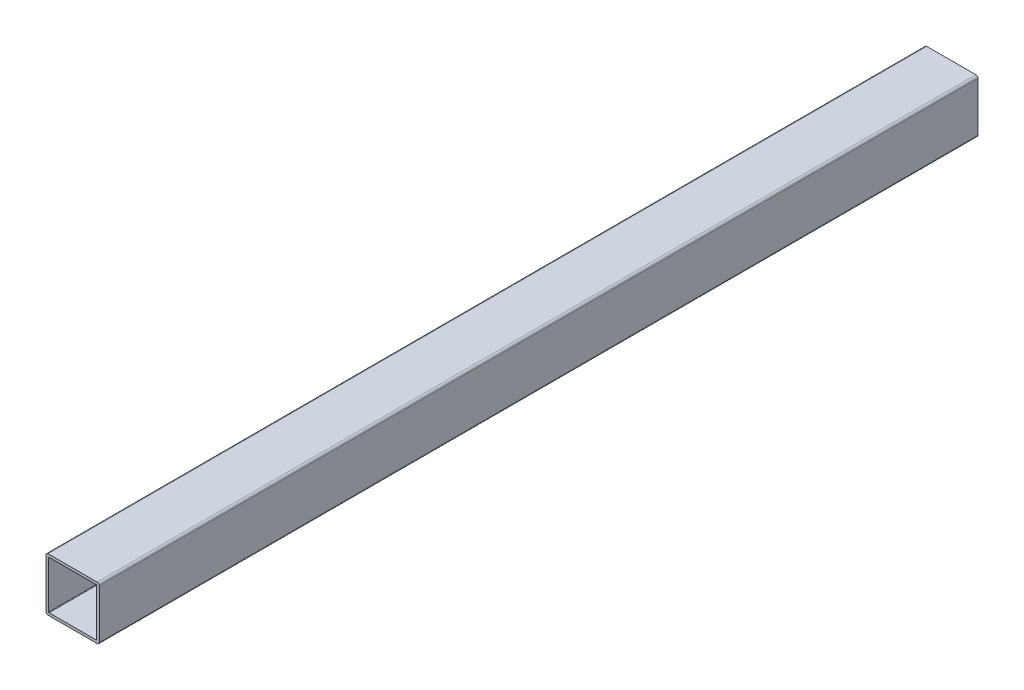
ISO-10303-21;
HEADER;
FILE_DESCRIPTION(('STEP AP214'),'2;1');
FILE_NAME('part.step','',(''),(''),'','','');
FILE_SCHEMA(('AUTOMOTIVE_DESIGN { 1 0 10303 214 1 1 1 1 }'));
ENDSEC;
DATA;
#1=APPLICATION_CONTEXT('core data for automotive mechanical design processes');
#2=APPLICATION_PROTOCOL_DEFINITION('international standard','automotive_design',2000,#1);
#3=PRODUCT_CONTEXT('',#1,'mechanical');
#4=PRODUCT('Part','Part','',(#3));
#5=PRODUCT_RELATED_PRODUCT_CATEGORY('part','',(#4));
#6=PRODUCT_DEFINITION_FORMATION('','',#4);
#7=PRODUCT_DEFINITION_CONTEXT('part definition',#1,'design');
#8=PRODUCT_DEFINITION('design','',#6,#7);
#9=PRODUCT_DEFINITION_SHAPE('','',#8);
#10=(LENGTH_UNIT() NAMED_UNIT(*) SI_UNIT(.MILLI.,.METRE.));
#11=(NAMED_UNIT(*) PLANE_ANGLE_UNIT() SI_UNIT($,.RADIAN.));
#12=(NAMED_UNIT(*) SI_UNIT($,.STERADIAN.) SOLID_ANGLE_UNIT());
#13=UNCERTAINTY_MEASURE_WITH_UNIT(LENGTH_MEASURE(1.E-05),#10,'distance_accuracy_value','');
#14=(GEOMETRIC_REPRESENTATION_CONTEXT(3) GLOBAL_UNCERTAINTY_ASSIGNED_CONTEXT((#13)) GLOBAL_UNIT_ASSIGNED_CONTEXT((#10,
#11,#12)) REPRESENTATION_CONTEXT('',''));
#15=CARTESIAN_POINT('',(0.,0.,0.));
#16=DIRECTION('',(0.,0.,1.));
#17=DIRECTION('',(1.,0.,0.));
#18=AXIS2_PLACEMENT_3D('',#15,#16,#17);
#19=CARTESIAN_POINT('',(1175.,100.,-825.));
#20=DIRECTION('',(-1.,0.,0.));
#21=DIRECTION('',(0.,0.,1.));
#22=AXIS2_PLACEMENT_3D('',#19,#20,#21);
#23=PLANE('',#22);
#24=DIRECTION('',(0.,0.,1.));
#25=VECTOR('',#24,1.);
#26=CARTESIAN_POINT('',(1175.,596.,-825.));
#27=LINE('',#26,#25);
#28=CARTESIAN_POINT('',(1175.,596.,825.));
#29=VERTEX_POINT('',#28);
#30=CARTESIAN_POINT('',(1175.,596.,-825.));
#31=VERTEX_POINT('',#30);
#32=EDGE_CURVE('E143',#29,#31,#27,.F.);
#33=ORIENTED_EDGE('',*,*,#32,.T.);
#34=DIRECTION('',(0.,1.,0.));
#35=VECTOR('',#34,1.);
#36=CARTESIAN_POINT('',(1175.,500.,-825.));
#37=LINE('',#36,#35);
#38=CARTESIAN_POINT('',(1175.,504.,-825.));
#39=VERTEX_POINT('',#38);
#40=EDGE_CURVE('E218',#39,#31,#37,.T.);
#41=ORIENTED_EDGE('',*,*,#40,.F.);
#42=DIRECTION('',(0.,0.,-1.));
#43=VECTOR('',#42,1.);
#44=CARTESIAN_POINT('',(1175.,504.,-825.));
#45=LINE('',#44,#43);
#46=CARTESIAN_POINT('',(1175.,504.,825.));
#47=VERTEX_POINT('',#46);
#48=EDGE_CURVE('E157',#39,#47,#45,.F.);
#49=ORIENTED_EDGE('',*,*,#48,.T.);
#50=DIRECTION('',(0.,1.,0.));
#51=VECTOR('',#50,1.);
#52=CARTESIAN_POINT('',(1175.,500.,825.));
#53=LINE('',#52,#51);
#54=EDGE_CURVE('E220',#47,#29,#53,.T.);
#55=ORIENTED_EDGE('',*,*,#54,.T.);
#56=EDGE_LOOP('',(#33,#41,#49,#55));
#57=FACE_BOUND('',#56,.T.);
#58=ADVANCED_FACE('F19',(#57),#23,.T.);
#59=CARTESIAN_POINT('',(-358.3,500.,825.));
#60=DIRECTION('',(0.,-1.,0.));
#61=DIRECTION('',(0.,0.,-1.));
#62=AXIS2_PLACEMENT_3D('',#59,#60,#61);
#63=PLANE('',#62);
#64=DIRECTION('',(0.,0.,-1.));
#65=VECTOR('',#64,1.);
#66=CARTESIAN_POINT('',(1179.,500.,825.));
#67=LINE('',#66,#65);
#68=CARTESIAN_POINT('',(1179.,500.,825.));
#69=VERTEX_POINT('',#68);
#70=CARTESIAN_POINT('',(1179.,500.,-825.));
#71=VERTEX_POINT('',#70);
#72=EDGE_CURVE('E133',#69,#71,#67,.T.);
#73=ORIENTED_EDGE('',*,*,#72,.T.);
#74=DIRECTION('',(-1.,0.,0.));
#75=VECTOR('',#74,1.);
#76=CARTESIAN_POINT('',(1175.,500.,-825.));
#77=LINE('',#76,#75);
#78=CARTESIAN_POINT('',(1271.,500.,-825.));
#79=VERTEX_POINT('',#78);
#80=EDGE_CURVE('E136',#71,#79,#77,.F.);
#81=ORIENTED_EDGE('',*,*,#80,.T.);
#82=DIRECTION('',(0.,0.,-1.));
#83=VECTOR('',#82,1.);
#84=CARTESIAN_POINT('',(1271.,500.,825.));
#85=LINE('',#84,#83);
#86=CARTESIAN_POINT('',(1271.,500.,825.));
#87=VERTEX_POINT('',#86);
#88=EDGE_CURVE('E144',#79,#87,#85,.F.);
#89=ORIENTED_EDGE('',*,*,#88,.T.);
#90=DIRECTION('',(1.,0.,0.));
#91=VECTOR('',#90,1.);
#92=CARTESIAN_POINT('',(0.,500.,825.));
#93=LINE('',#92,#91);
#94=EDGE_CURVE('E139',#69,#87,#93,.T.);
#95=ORIENTED_EDGE('',*,*,#94,.F.);
#96=EDGE_LOOP('',(#73,#81,#89,#95));
#97=FACE_BOUND('',#96,.T.);
#98=ADVANCED_FACE('F135',(#97),#63,.T.);
#99=CARTESIAN_POINT('',(-1275.,100.,825.));
#100=DIRECTION('',(0.,0.,-1.));
#101=DIRECTION('',(-1.,0.,0.));
#102=AXIS2_PLACEMENT_3D('',#99,#100,#101);
#103=PLANE('',#102);
#104=DIRECTION('',(1.,0.,0.));
#105=VECTOR('',#104,1.);
#106=CARTESIAN_POINT('',(-1275.,595.,825.));
#107=LINE('',#106,#105);
#108=CARTESIAN_POINT('',(1181.,595.,825.));
#109=VERTEX_POINT('',#108);
#110=CARTESIAN_POINT('',(1269.,595.,825.));
#111=VERTEX_POINT('',#110);
#112=EDGE_CURVE('E176',#109,#111,#107,.T.);
#113=ORIENTED_EDGE('',*,*,#112,.T.);
#114=CARTESIAN_POINT('',(1269.,594.,825.));
#115=DIRECTION('',(0.,0.,-1.));
#116=DIRECTION('',(-1.,0.,0.));
#117=AXIS2_PLACEMENT_3D('',#114,#115,#116);
#118=CIRCLE('',#117,1.);
#119=CARTESIAN_POINT('',(1270.,594.,825.));
#120=VERTEX_POINT('',#119);
#121=EDGE_CURVE('E239',#111,#120,#118,.T.);
#122=ORIENTED_EDGE('',*,*,#121,.T.);
#123=DIRECTION('',(0.,-1.,0.));
#124=VECTOR('',#123,1.);
#125=CARTESIAN_POINT('',(1270.,100.,825.));
#126=LINE('',#125,#124);
#127=CARTESIAN_POINT('',(1270.,506.,825.));
#128=VERTEX_POINT('',#127);
#129=EDGE_CURVE('E179',#120,#128,#126,.T.);
#130=ORIENTED_EDGE('',*,*,#129,.T.);
#131=CARTESIAN_POINT('',(1269.,506.,825.));
#132=DIRECTION('',(0.,0.,-1.));
#133=DIRECTION('',(-1.,0.,0.));
#134=AXIS2_PLACEMENT_3D('',#131,#132,#133);
#135=CIRCLE('',#134,1.);
#136=CARTESIAN_POINT('',(1269.,505.,825.));
#137=VERTEX_POINT('',#136);
#138=EDGE_CURVE('E251',#128,#137,#135,.T.);
#139=ORIENTED_EDGE('',*,*,#138,.T.);
#140=DIRECTION('',(-1.,0.,0.));
#141=VECTOR('',#140,1.);
#142=CARTESIAN_POINT('',(-1275.,505.,825.));
#143=LINE('',#142,#141);
#144=CARTESIAN_POINT('',(1181.,505.,825.));
#145=VERTEX_POINT('',#144);
#146=EDGE_CURVE('E154',#137,#145,#143,.T.);
#147=ORIENTED_EDGE('',*,*,#146,.T.);
#148=CARTESIAN_POINT('',(1181.,506.,825.));
#149=DIRECTION('',(0.,0.,-1.));
#150=DIRECTION('',(-1.,0.,0.));
#151=AXIS2_PLACEMENT_3D('',#148,#149,#150);
#152=CIRCLE('',#151,1.);
#153=CARTESIAN_POINT('',(1180.,506.,825.));
#154=VERTEX_POINT('',#153);
#155=EDGE_CURVE('E242',#145,#154,#152,.T.);
#156=ORIENTED_EDGE('',*,*,#155,.T.);
#157=DIRECTION('',(0.,1.,0.));
#158=VECTOR('',#157,1.);
#159=CARTESIAN_POINT('',(1180.,100.000000000012,825.));
#160=LINE('',#159,#158);
#161=CARTESIAN_POINT('',(1180.,594.,825.));
#162=VERTEX_POINT('',#161);
#163=EDGE_CURVE('E180',#154,#162,#160,.T.);
#164=ORIENTED_EDGE('',*,*,#163,.T.);
#165=CARTESIAN_POINT('',(1181.,594.,825.));
#166=DIRECTION('',(0.,0.,-1.));
#167=DIRECTION('',(-1.,0.,0.));
#168=AXIS2_PLACEMENT_3D('',#165,#166,#167);
#169=CIRCLE('',#168,1.);
#170=EDGE_CURVE('E12',#162,#109,#169,.T.);
#171=ORIENTED_EDGE('',*,*,#170,.T.);
#172=EDGE_LOOP('',(#113,#122,#130,#139,#147,#156,#164,#171));
#173=FACE_BOUND('',#172,.T.);
#174=ORIENTED_EDGE('',*,*,#54,.F.);
#175=CARTESIAN_POINT('',(1179.,504.,825.));
#176=DIRECTION('',(0.,0.,-1.));
#177=DIRECTION('',(-1.,0.,0.));
#178=AXIS2_PLACEMENT_3D('',#175,#176,#177);
#179=CIRCLE('',#178,4.);
#180=EDGE_CURVE('E280',#47,#69,#179,.F.);
#181=ORIENTED_EDGE('',*,*,#180,.T.);
#182=ORIENTED_EDGE('',*,*,#94,.T.);
#183=CARTESIAN_POINT('',(1271.,504.,825.));
#184=DIRECTION('',(0.,0.,-1.));
#185=DIRECTION('',(-1.,0.,0.));
#186=AXIS2_PLACEMENT_3D('',#183,#184,#185);
#187=CIRCLE('',#186,4.);
#188=CARTESIAN_POINT('',(1275.,504.,825.));
#189=VERTEX_POINT('',#188);
#190=EDGE_CURVE('E282',#87,#189,#187,.F.);
#191=ORIENTED_EDGE('',*,*,#190,.T.);
#192=DIRECTION('',(0.,1.,0.));
#193=VECTOR('',#192,1.);
#194=CARTESIAN_POINT('',(1275.,600.,825.));
#195=LINE('',#194,#193);
#196=CARTESIAN_POINT('',(1275.,596.,825.));
#197=VERTEX_POINT('',#196);
#198=EDGE_CURVE('E186',#189,#197,#195,.T.);
#199=ORIENTED_EDGE('',*,*,#198,.T.);
#200=CARTESIAN_POINT('',(1271.,596.,825.));
#201=DIRECTION('',(0.,0.,-1.));
#202=DIRECTION('',(-1.,0.,0.));
#203=AXIS2_PLACEMENT_3D('',#200,#201,#202);
#204=CIRCLE('',#203,4.);
#205=CARTESIAN_POINT('',(1271.,600.,825.));
#206=VERTEX_POINT('',#205);
#207=EDGE_CURVE('E284',#197,#206,#204,.F.);
#208=ORIENTED_EDGE('',*,*,#207,.T.);
#209=DIRECTION('',(-1.,0.,0.));
#210=VECTOR('',#209,1.);
#211=CARTESIAN_POINT('',(-1275.,600.,825.));
#212=LINE('',#211,#210);
#213=CARTESIAN_POINT('',(1179.,600.,825.));
#214=VERTEX_POINT('',#213);
#215=EDGE_CURVE('E190',#206,#214,#212,.T.);
#216=ORIENTED_EDGE('',*,*,#215,.T.);
#217=CARTESIAN_POINT('',(1179.,596.,825.));
#218=DIRECTION('',(0.,0.,-1.));
#219=DIRECTION('',(-1.,0.,0.));
#220=AXIS2_PLACEMENT_3D('',#217,#218,#219);
#221=CIRCLE('',#220,4.);
#222=EDGE_CURVE('E285',#214,#29,#221,.F.);
#223=ORIENTED_EDGE('',*,*,#222,.T.);
#224=EDGE_LOOP('',(#174,#181,#182,#191,#199,#208,#216,#223));
#225=FACE_BOUND('',#224,.T.);
#226=ADVANCED_FACE('F255',(#173,#225),#103,.F.);
#227=CARTESIAN_POINT('',(-1275.,600.,50.));
#228=DIRECTION('',(0.,1.,0.));
#229=DIRECTION('',(0.,0.,1.));
#230=AXIS2_PLACEMENT_3D('',#227,#228,#229);
#231=PLANE('',#230);
#232=ORIENTED_EDGE('',*,*,#215,.F.);
#233=DIRECTION('',(0.,0.,-1.));
#234=VECTOR('',#233,1.);
#235=CARTESIAN_POINT('',(1271.,600.,50.));
#236=LINE('',#235,#234);
#237=CARTESIAN_POINT('',(1271.,600.,-825.));
#238=VERTEX_POINT('',#237);
#239=EDGE_CURVE('E161',#206,#238,#236,.T.);
#240=ORIENTED_EDGE('',*,*,#239,.T.);
#241=DIRECTION('',(1.,0.,0.));
#242=VECTOR('',#241,1.);
#243=CARTESIAN_POINT('',(-1275.,600.,-825.));
#244=LINE('',#243,#242);
#245=CARTESIAN_POINT('',(1179.,600.,-825.));
#246=VERTEX_POINT('',#245);
#247=EDGE_CURVE('E224',#246,#238,#244,.T.);
#248=ORIENTED_EDGE('',*,*,#247,.F.);
#249=DIRECTION('',(0.,0.,1.));
#250=VECTOR('',#249,1.);
#251=CARTESIAN_POINT('',(1179.,600.,50.));
#252=LINE('',#251,#250);
#253=EDGE_CURVE('E158',#246,#214,#252,.T.);
#254=ORIENTED_EDGE('',*,*,#253,.T.);
#255=EDGE_LOOP('',(#232,#240,#248,#254));
#256=FACE_BOUND('',#255,.T.);
#257=ADVANCED_FACE('F295',(#256),#231,.T.);
#258=CARTESIAN_POINT('',(-1175.,100.,-825.));
#259=DIRECTION('',(0.,0.,1.));
#260=DIRECTION('',(1.,0.,0.));
#261=AXIS2_PLACEMENT_3D('',#258,#259,#260);
#262=PLANE('',#261);
#263=DIRECTION('',(-1.,0.,0.));
#264=VECTOR('',#263,1.);
#265=CARTESIAN_POINT('',(-1175.,595.,-825.));
#266=LINE('',#265,#264);
#267=CARTESIAN_POINT('',(1269.,595.,-825.));
#268=VERTEX_POINT('',#267);
#269=CARTESIAN_POINT('',(1181.,595.,-825.));
#270=VERTEX_POINT('',#269);
#271=EDGE_CURVE('E202',#268,#270,#266,.T.);
#272=ORIENTED_EDGE('',*,*,#271,.T.);
#273=CARTESIAN_POINT('',(1181.,594.,-825.));
#274=DIRECTION('',(0.,0.,1.));
#275=DIRECTION('',(1.,0.,0.));
#276=AXIS2_PLACEMENT_3D('',#273,#274,#275);
#277=CIRCLE('',#276,1.);
#278=CARTESIAN_POINT('',(1180.,594.,-825.));
#279=VERTEX_POINT('',#278);
#280=EDGE_CURVE('E27',#270,#279,#277,.T.);
#281=ORIENTED_EDGE('',*,*,#280,.T.);
#282=DIRECTION('',(0.,-1.,0.));
#283=VECTOR('',#282,1.);
#284=CARTESIAN_POINT('',(1180.,100.000000000012,-825.));
#285=LINE('',#284,#283);
#286=CARTESIAN_POINT('',(1180.,506.,-825.));
#287=VERTEX_POINT('',#286);
#288=EDGE_CURVE('E223',#279,#287,#285,.T.);
#289=ORIENTED_EDGE('',*,*,#288,.T.);
#290=CARTESIAN_POINT('',(1181.,506.,-825.));
#291=DIRECTION('',(0.,0.,1.));
#292=DIRECTION('',(1.,0.,0.));
#293=AXIS2_PLACEMENT_3D('',#290,#291,#292);
#294=CIRCLE('',#293,1.);
#295=CARTESIAN_POINT('',(1181.,505.,-825.));
#296=VERTEX_POINT('',#295);
#297=EDGE_CURVE('E240',#287,#296,#294,.T.);
#298=ORIENTED_EDGE('',*,*,#297,.T.);
#299=DIRECTION('',(1.,0.,0.));
#300=VECTOR('',#299,1.);
#301=CARTESIAN_POINT('',(-1175.,505.,-825.));
#302=LINE('',#301,#300);
#303=CARTESIAN_POINT('',(1269.,505.,-825.));
#304=VERTEX_POINT('',#303);
#305=EDGE_CURVE('E201',#296,#304,#302,.T.);
#306=ORIENTED_EDGE('',*,*,#305,.T.);
#307=CARTESIAN_POINT('',(1269.,506.,-825.));
#308=DIRECTION('',(0.,0.,1.));
#309=DIRECTION('',(1.,0.,0.));
#310=AXIS2_PLACEMENT_3D('',#307,#308,#309);
#311=CIRCLE('',#310,1.);
#312=CARTESIAN_POINT('',(1270.,506.,-825.));
#313=VERTEX_POINT('',#312);
#314=EDGE_CURVE('E249',#304,#313,#311,.T.);
#315=ORIENTED_EDGE('',*,*,#314,.T.);
#316=DIRECTION('',(0.,1.,0.));
#317=VECTOR('',#316,1.);
#318=CARTESIAN_POINT('',(1270.,100.,-825.));
#319=LINE('',#318,#317);
#320=CARTESIAN_POINT('',(1270.,594.,-825.));
#321=VERTEX_POINT('',#320);
#322=EDGE_CURVE('E197',#313,#321,#319,.T.);
#323=ORIENTED_EDGE('',*,*,#322,.T.);
#324=CARTESIAN_POINT('',(1269.,594.,-825.));
#325=DIRECTION('',(0.,0.,1.));
#326=DIRECTION('',(1.,0.,0.));
#327=AXIS2_PLACEMENT_3D('',#324,#325,#326);
#328=CIRCLE('',#327,1.);
#329=EDGE_CURVE('E229',#321,#268,#328,.T.);
#330=ORIENTED_EDGE('',*,*,#329,.T.);
#331=EDGE_LOOP('',(#272,#281,#289,#298,#306,#315,#323,#330));
#332=FACE_BOUND('',#331,.T.);
#333=ORIENTED_EDGE('',*,*,#80,.F.);
#334=CARTESIAN_POINT('',(1179.,504.,-825.));
#335=DIRECTION('',(0.,0.,1.));
#336=DIRECTION('',(1.,0.,0.));
#337=AXIS2_PLACEMENT_3D('',#334,#335,#336);
#338=CIRCLE('',#337,4.);
#339=EDGE_CURVE('E150',#71,#39,#338,.F.);
#340=ORIENTED_EDGE('',*,*,#339,.T.);
#341=ORIENTED_EDGE('',*,*,#40,.T.);
#342=CARTESIAN_POINT('',(1179.,596.,-825.));
#343=DIRECTION('',(0.,0.,1.));
#344=DIRECTION('',(1.,0.,0.));
#345=AXIS2_PLACEMENT_3D('',#342,#343,#344);
#346=CIRCLE('',#345,4.);
#347=EDGE_CURVE('E159',#31,#246,#346,.F.);
#348=ORIENTED_EDGE('',*,*,#347,.T.);
#349=ORIENTED_EDGE('',*,*,#247,.T.);
#350=CARTESIAN_POINT('',(1271.,596.,-825.));
#351=DIRECTION('',(0.,0.,1.));
#352=DIRECTION('',(1.,0.,0.));
#353=AXIS2_PLACEMENT_3D('',#350,#351,#352);
#354=CIRCLE('',#353,4.);
#355=CARTESIAN_POINT('',(1275.,596.,-825.));
#356=VERTEX_POINT('',#355);
#357=EDGE_CURVE('E298',#238,#356,#354,.F.);
#358=ORIENTED_EDGE('',*,*,#357,.T.);
#359=DIRECTION('',(0.,-1.,0.));
#360=VECTOR('',#359,1.);
#361=CARTESIAN_POINT('',(1275.,600.,-825.));
#362=LINE('',#361,#360);
#363=CARTESIAN_POINT('',(1275.,504.,-825.));
#364=VERTEX_POINT('',#363);
#365=EDGE_CURVE('E191',#356,#364,#362,.T.);
#366=ORIENTED_EDGE('',*,*,#365,.T.);
#367=CARTESIAN_POINT('',(1271.,504.,-825.));
#368=DIRECTION('',(0.,0.,1.));
#369=DIRECTION('',(1.,0.,0.));
#370=AXIS2_PLACEMENT_3D('',#367,#368,#369);
#371=CIRCLE('',#370,4.);
#372=EDGE_CURVE('E153',#364,#79,#371,.F.);
#373=ORIENTED_EDGE('',*,*,#372,.T.);
#374=EDGE_LOOP('',(#333,#340,#341,#348,#349,#358,#366,#373));
#375=FACE_BOUND('',#374,.T.);
#376=ADVANCED_FACE('F148',(#332,#375),#262,.F.);
#377=CARTESIAN_POINT('',(1275.,600.,915.));
#378=DIRECTION('',(1.,0.,0.));
#379=DIRECTION('',(0.,0.,-1.));
#380=AXIS2_PLACEMENT_3D('',#377,#378,#379);
#381=PLANE('',#380);
#382=ORIENTED_EDGE('',*,*,#198,.F.);
#383=DIRECTION('',(0.,0.,-1.));
#384=VECTOR('',#383,1.);
#385=CARTESIAN_POINT('',(1275.,504.,915.));
#386=LINE('',#385,#384);
#387=EDGE_CURVE('E274',#189,#364,#386,.T.);
#388=ORIENTED_EDGE('',*,*,#387,.T.);
#389=ORIENTED_EDGE('',*,*,#365,.F.);
#390=DIRECTION('',(0.,0.,-1.));
#391=VECTOR('',#390,1.);
#392=CARTESIAN_POINT('',(1275.,596.,915.));
#393=LINE('',#392,#391);
#394=EDGE_CURVE('E278',#356,#197,#393,.F.);
#395=ORIENTED_EDGE('',*,*,#394,.T.);
#396=EDGE_LOOP('',(#382,#388,#389,#395));
#397=FACE_BOUND('',#396,.T.);
#398=ADVANCED_FACE('F304',(#397),#381,.T.);
#399=CARTESIAN_POINT('',(1270.,505.,925.000000000002));
#400=DIRECTION('',(0.,-1.,0.));
#401=DIRECTION('',(0.,0.,-1.));
#402=AXIS2_PLACEMENT_3D('',#399,#400,#401);
#403=PLANE('',#402);
#404=ORIENTED_EDGE('',*,*,#305,.F.);
#405=DIRECTION('',(0.,0.,-1.));
#406=VECTOR('',#405,1.);
#407=CARTESIAN_POINT('',(1181.,505.,825.));
#408=LINE('',#407,#406);
#409=EDGE_CURVE('E263',#296,#145,#408,.F.);
#410=ORIENTED_EDGE('',*,*,#409,.T.);
#411=ORIENTED_EDGE('',*,*,#146,.F.);
#412=DIRECTION('',(0.,0.,-1.));
#413=VECTOR('',#412,1.);
#414=CARTESIAN_POINT('',(1269.,505.,-825.));
#415=LINE('',#414,#413);
#416=EDGE_CURVE('E265',#137,#304,#415,.T.);
#417=ORIENTED_EDGE('',*,*,#416,.T.);
#418=EDGE_LOOP('',(#404,#410,#411,#417));
#419=FACE_BOUND('',#418,.T.);
#420=ADVANCED_FACE('F330',(#419),#403,.F.);
#421=CARTESIAN_POINT('',(1270.,595.,925.000000000002));
#422=DIRECTION('',(1.,0.,0.));
#423=DIRECTION('',(0.,0.,-1.));
#424=AXIS2_PLACEMENT_3D('',#421,#422,#423);
#425=PLANE('',#424);
#426=ORIENTED_EDGE('',*,*,#322,.F.);
#427=DIRECTION('',(0.,0.,-1.));
#428=VECTOR('',#427,1.);
#429=CARTESIAN_POINT('',(1270.,506.,825.));
#430=LINE('',#429,#428);
#431=EDGE_CURVE('E244',#313,#128,#430,.F.);
#432=ORIENTED_EDGE('',*,*,#431,.T.);
#433=ORIENTED_EDGE('',*,*,#129,.F.);
#434=DIRECTION('',(0.,0.,-1.));
#435=VECTOR('',#434,1.);
#436=CARTESIAN_POINT('',(1270.,594.,-825.));
#437=LINE('',#436,#435);
#438=EDGE_CURVE('E261',#120,#321,#437,.T.);
#439=ORIENTED_EDGE('',*,*,#438,.T.);
#440=EDGE_LOOP('',(#426,#432,#433,#439));
#441=FACE_BOUND('',#440,.T.);
#442=ADVANCED_FACE('F260',(#441),#425,.F.);
#443=CARTESIAN_POINT('',(1180.,595.,925.000000000002));
#444=DIRECTION('',(0.,1.,0.));
#445=DIRECTION('',(0.,0.,1.));
#446=AXIS2_PLACEMENT_3D('',#443,#444,#445);
#447=PLANE('',#446);
#448=ORIENTED_EDGE('',*,*,#271,.F.);
#449=DIRECTION('',(0.,0.,-1.));
#450=VECTOR('',#449,1.);
#451=CARTESIAN_POINT('',(1269.,595.,825.));
#452=LINE('',#451,#450);
#453=EDGE_CURVE('E34',#268,#111,#452,.F.);
#454=ORIENTED_EDGE('',*,*,#453,.T.);
#455=ORIENTED_EDGE('',*,*,#112,.F.);
#456=DIRECTION('',(0.,0.,-1.));
#457=VECTOR('',#456,1.);
#458=CARTESIAN_POINT('',(1181.,595.,-825.));
#459=LINE('',#458,#457);
#460=EDGE_CURVE('E233',#109,#270,#459,.T.);
#461=ORIENTED_EDGE('',*,*,#460,.T.);
#462=EDGE_LOOP('',(#448,#454,#455,#461));
#463=FACE_BOUND('',#462,.T.);
#464=ADVANCED_FACE('F231',(#463),#447,.F.);
#465=CARTESIAN_POINT('',(1180.,505.,925.000000000002));
#466=DIRECTION('',(-1.,0.,0.));
#467=DIRECTION('',(0.,-1.,0.));
#468=AXIS2_PLACEMENT_3D('',#465,#466,#467);
#469=PLANE('',#468);
#470=ORIENTED_EDGE('',*,*,#163,.F.);
#471=DIRECTION('',(0.,0.,-1.));
#472=VECTOR('',#471,1.);
#473=CARTESIAN_POINT('',(1180.,506.,-825.));
#474=LINE('',#473,#472);
#475=EDGE_CURVE('E270',#154,#287,#474,.T.);
#476=ORIENTED_EDGE('',*,*,#475,.T.);
#477=ORIENTED_EDGE('',*,*,#288,.F.);
#478=DIRECTION('',(0.,0.,-1.));
#479=VECTOR('',#478,1.);
#480=CARTESIAN_POINT('',(1180.,594.,825.));
#481=LINE('',#480,#479);
#482=EDGE_CURVE('E273',#279,#162,#481,.F.);
#483=ORIENTED_EDGE('',*,*,#482,.T.);
#484=EDGE_LOOP('',(#470,#476,#477,#483));
#485=FACE_BOUND('',#484,.T.);
#486=ADVANCED_FACE('F322',(#485),#469,.F.);
#487=CARTESIAN_POINT('',(1179.,504.,825.));
#488=DIRECTION('',(0.,0.,-1.));
#489=DIRECTION('',(-1.,0.,0.));
#490=AXIS2_PLACEMENT_3D('',#487,#488,#489);
#491=CYLINDRICAL_SURFACE('',#490,4.);
#492=ORIENTED_EDGE('',*,*,#339,.F.);
#493=ORIENTED_EDGE('',*,*,#72,.F.);
#494=ORIENTED_EDGE('',*,*,#180,.F.);
#495=ORIENTED_EDGE('',*,*,#48,.F.);
#496=EDGE_LOOP('',(#492,#493,#494,#495));
#497=FACE_BOUND('',#496,.T.);
#498=ADVANCED_FACE('F156',(#497),#491,.T.);
#499=CARTESIAN_POINT('',(1179.,596.,50.));
#500=DIRECTION('',(0.,0.,1.));
#501=DIRECTION('',(1.,0.,0.));
#502=AXIS2_PLACEMENT_3D('',#499,#500,#501);
#503=CYLINDRICAL_SURFACE('',#502,4.);
#504=ORIENTED_EDGE('',*,*,#347,.F.);
#505=ORIENTED_EDGE('',*,*,#32,.F.);
#506=ORIENTED_EDGE('',*,*,#222,.F.);
#507=ORIENTED_EDGE('',*,*,#253,.F.);
#508=EDGE_LOOP('',(#504,#505,#506,#507));
#509=FACE_BOUND('',#508,.T.);
#510=ADVANCED_FACE('F313',(#509),#503,.T.);
#511=CARTESIAN_POINT('',(1271.,504.,915.));
#512=DIRECTION('',(0.,0.,-1.));
#513=DIRECTION('',(-1.,0.,0.));
#514=AXIS2_PLACEMENT_3D('',#511,#512,#513);
#515=CYLINDRICAL_SURFACE('',#514,4.);
#516=ORIENTED_EDGE('',*,*,#190,.F.);
#517=ORIENTED_EDGE('',*,*,#88,.F.);
#518=ORIENTED_EDGE('',*,*,#372,.F.);
#519=ORIENTED_EDGE('',*,*,#387,.F.);
#520=EDGE_LOOP('',(#516,#517,#518,#519));
#521=FACE_BOUND('',#520,.T.);
#522=ADVANCED_FACE('F309',(#521),#515,.T.);
#523=CARTESIAN_POINT('',(1271.,596.,50.));
#524=DIRECTION('',(0.,0.,-1.));
#525=DIRECTION('',(-1.,0.,0.));
#526=AXIS2_PLACEMENT_3D('',#523,#524,#525);
#527=CYLINDRICAL_SURFACE('',#526,4.);
#528=ORIENTED_EDGE('',*,*,#207,.F.);
#529=ORIENTED_EDGE('',*,*,#394,.F.);
#530=ORIENTED_EDGE('',*,*,#357,.F.);
#531=ORIENTED_EDGE('',*,*,#239,.F.);
#532=EDGE_LOOP('',(#528,#529,#530,#531));
#533=FACE_BOUND('',#532,.T.);
#534=ADVANCED_FACE('F306',(#533),#527,.T.);
#535=CARTESIAN_POINT('',(1181.,506.,925.000000000002));
#536=DIRECTION('',(0.,0.,1.));
#537=DIRECTION('',(1.,0.,0.));
#538=AXIS2_PLACEMENT_3D('',#535,#536,#537);
#539=CYLINDRICAL_SURFACE('',#538,1.);
#540=ORIENTED_EDGE('',*,*,#155,.F.);
#541=ORIENTED_EDGE('',*,*,#409,.F.);
#542=ORIENTED_EDGE('',*,*,#297,.F.);
#543=ORIENTED_EDGE('',*,*,#475,.F.);
#544=EDGE_LOOP('',(#540,#541,#542,#543));
#545=FACE_BOUND('',#544,.T.);
#546=ADVANCED_FACE('F400',(#545),#539,.F.);
#547=CARTESIAN_POINT('',(1269.,506.,925.000000000002));
#548=DIRECTION('',(0.,0.,1.));
#549=DIRECTION('',(1.,0.,0.));
#550=AXIS2_PLACEMENT_3D('',#547,#548,#549);
#551=CYLINDRICAL_SURFACE('',#550,1.);
#552=ORIENTED_EDGE('',*,*,#138,.F.);
#553=ORIENTED_EDGE('',*,*,#431,.F.);
#554=ORIENTED_EDGE('',*,*,#314,.F.);
#555=ORIENTED_EDGE('',*,*,#416,.F.);
#556=EDGE_LOOP('',(#552,#553,#554,#555));
#557=FACE_BOUND('',#556,.T.);
#558=ADVANCED_FACE('F409',(#557),#551,.F.);
#559=CARTESIAN_POINT('',(1269.,594.,925.000000000002));
#560=DIRECTION('',(0.,0.,1.));
#561=DIRECTION('',(1.,0.,0.));
#562=AXIS2_PLACEMENT_3D('',#559,#560,#561);
#563=CYLINDRICAL_SURFACE('',#562,1.);
#564=ORIENTED_EDGE('',*,*,#121,.F.);
#565=ORIENTED_EDGE('',*,*,#453,.F.);
#566=ORIENTED_EDGE('',*,*,#329,.F.);
#567=ORIENTED_EDGE('',*,*,#438,.F.);
#568=EDGE_LOOP('',(#564,#565,#566,#567));
#569=FACE_BOUND('',#568,.T.);
#570=ADVANCED_FACE('F236',(#569),#563,.F.);
#571=CARTESIAN_POINT('',(1181.,594.,925.000000000002));
#572=DIRECTION('',(0.,0.,1.));
#573=DIRECTION('',(1.,0.,0.));
#574=AXIS2_PLACEMENT_3D('',#571,#572,#573);
#575=CYLINDRICAL_SURFACE('',#574,1.);
#576=ORIENTED_EDGE('',*,*,#170,.F.);
#577=ORIENTED_EDGE('',*,*,#482,.F.);
#578=ORIENTED_EDGE('',*,*,#280,.F.);
#579=ORIENTED_EDGE('',*,*,#460,.F.);
#580=EDGE_LOOP('',(#576,#577,#578,#579));
#581=FACE_BOUND('',#580,.T.);
#582=ADVANCED_FACE('F21',(#581),#575,.F.);
#583=CLOSED_SHELL('',(#58,#98,#226,#257,#376,#398,#420,#442,#464,#486,#498,#510,#522,#534,#546,
#558,#570,#582));
#584=MANIFOLD_SOLID_BREP('B1',#583);
#585=ADVANCED_BREP_SHAPE_REPRESENTATION('',(#18,#584),#14);
#586=SHAPE_DEFINITION_REPRESENTATION(#9,#585);
ENDSEC;
END-ISO-10303-21;
